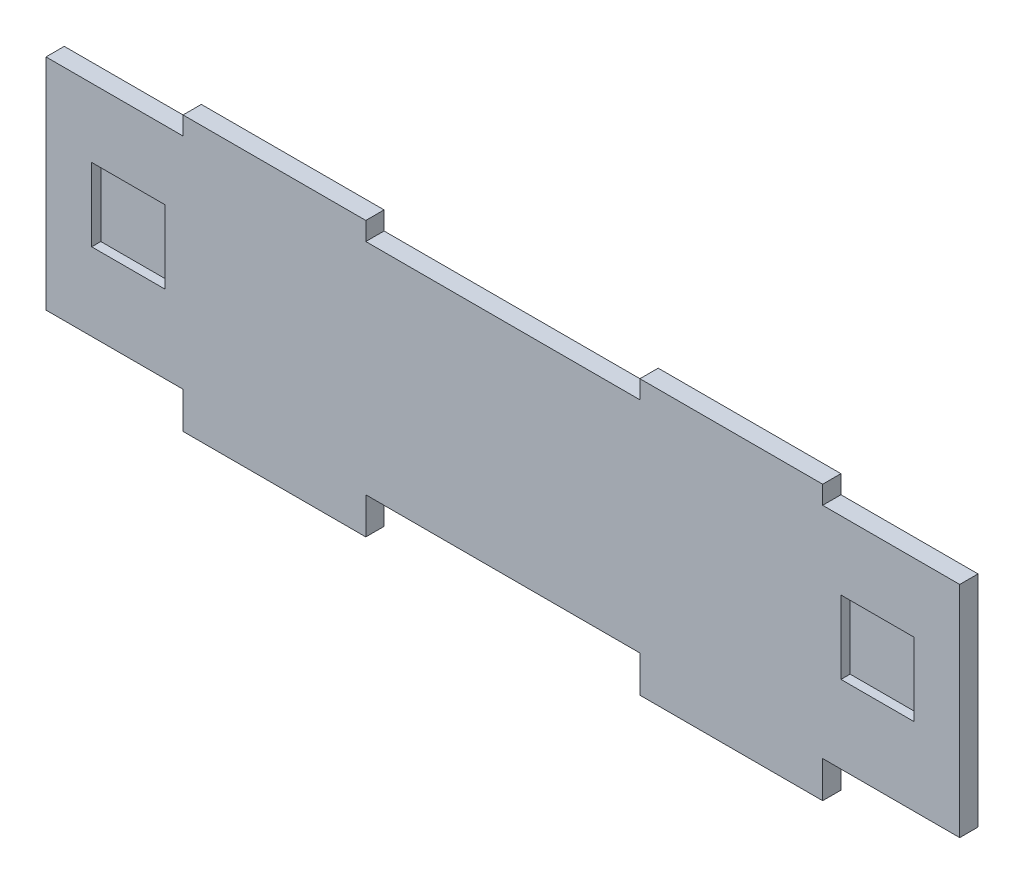
ISO-10303-21;
HEADER;
FILE_DESCRIPTION(('STEP AP214'),'2;1');
FILE_NAME('part.step','',(''),(''),'','','');
FILE_SCHEMA(('AUTOMOTIVE_DESIGN { 1 0 10303 214 1 1 1 1 }'));
ENDSEC;
DATA;
#1=APPLICATION_CONTEXT('core data for automotive mechanical design processes');
#2=APPLICATION_PROTOCOL_DEFINITION('international standard','automotive_design',2000,#1);
#3=PRODUCT_CONTEXT('',#1,'mechanical');
#4=PRODUCT('Part','Part','',(#3));
#5=PRODUCT_RELATED_PRODUCT_CATEGORY('part','',(#4));
#6=PRODUCT_DEFINITION_FORMATION('','',#4);
#7=PRODUCT_DEFINITION_CONTEXT('part definition',#1,'design');
#8=PRODUCT_DEFINITION('design','',#6,#7);
#9=PRODUCT_DEFINITION_SHAPE('','',#8);
#10=(LENGTH_UNIT() NAMED_UNIT(*) SI_UNIT(.MILLI.,.METRE.));
#11=(NAMED_UNIT(*) PLANE_ANGLE_UNIT() SI_UNIT($,.RADIAN.));
#12=(NAMED_UNIT(*) SI_UNIT($,.STERADIAN.) SOLID_ANGLE_UNIT());
#13=UNCERTAINTY_MEASURE_WITH_UNIT(LENGTH_MEASURE(1.E-05),#10,'distance_accuracy_value','');
#14=(GEOMETRIC_REPRESENTATION_CONTEXT(3) GLOBAL_UNCERTAINTY_ASSIGNED_CONTEXT((#13)) GLOBAL_UNIT_ASSIGNED_CONTEXT((#10,
#11,#12)) REPRESENTATION_CONTEXT('',''));
#15=CARTESIAN_POINT('',(0.,0.,0.));
#16=DIRECTION('',(0.,0.,1.));
#17=DIRECTION('',(1.,0.,0.));
#18=AXIS2_PLACEMENT_3D('',#15,#16,#17);
#19=CARTESIAN_POINT('',(30.,60.,4.));
#20=DIRECTION('',(1.,0.,0.));
#21=DIRECTION('',(0.,0.,-1.));
#22=AXIS2_PLACEMENT_3D('',#19,#20,#21);
#23=PLANE('',#22);
#24=DIRECTION('',(0.,-1.,0.));
#25=VECTOR('',#24,1.);
#26=CARTESIAN_POINT('',(30.,60.,0.));
#27=LINE('',#26,#25);
#28=CARTESIAN_POINT('',(30.,60.,0.));
#29=VERTEX_POINT('',#28);
#30=CARTESIAN_POINT('',(30.,56.,0.));
#31=VERTEX_POINT('',#30);
#32=EDGE_CURVE('E280',#29,#31,#27,.T.);
#33=ORIENTED_EDGE('',*,*,#32,.T.);
#34=DIRECTION('',(0.,0.,-1.));
#35=VECTOR('',#34,1.);
#36=CARTESIAN_POINT('',(30.,56.,4.));
#37=LINE('',#36,#35);
#38=CARTESIAN_POINT('',(30.,56.,4.));
#39=VERTEX_POINT('',#38);
#40=EDGE_CURVE('E11',#39,#31,#37,.T.);
#41=ORIENTED_EDGE('',*,*,#40,.F.);
#42=DIRECTION('',(0.,-1.,0.));
#43=VECTOR('',#42,1.);
#44=CARTESIAN_POINT('',(30.,60.,4.));
#45=LINE('',#44,#43);
#46=CARTESIAN_POINT('',(30.,60.,4.));
#47=VERTEX_POINT('',#46);
#48=EDGE_CURVE('E286',#47,#39,#45,.T.);
#49=ORIENTED_EDGE('',*,*,#48,.F.);
#50=DIRECTION('',(0.,0.,-1.));
#51=VECTOR('',#50,1.);
#52=CARTESIAN_POINT('',(30.,60.,4.));
#53=LINE('',#52,#51);
#54=EDGE_CURVE('E328',#47,#29,#53,.T.);
#55=ORIENTED_EDGE('',*,*,#54,.T.);
#56=EDGE_LOOP('',(#33,#41,#49,#55));
#57=FACE_BOUND('',#56,.T.);
#58=ADVANCED_FACE('F33',(#57),#23,.F.);
#59=CARTESIAN_POINT('',(0.,56.,4.));
#60=DIRECTION('',(0.,-1.,0.));
#61=DIRECTION('',(0.,0.,-1.));
#62=AXIS2_PLACEMENT_3D('',#59,#60,#61);
#63=PLANE('',#62);
#64=DIRECTION('',(-1.,0.,0.));
#65=VECTOR('',#64,1.);
#66=CARTESIAN_POINT('',(0.,56.,0.));
#67=LINE('',#66,#65);
#68=CARTESIAN_POINT('',(0.,56.,0.));
#69=VERTEX_POINT('',#68);
#70=EDGE_CURVE('E331',#31,#69,#67,.T.);
#71=ORIENTED_EDGE('',*,*,#70,.T.);
#72=DIRECTION('',(0.,0.,-1.));
#73=VECTOR('',#72,1.);
#74=CARTESIAN_POINT('',(0.,56.,4.));
#75=LINE('',#74,#73);
#76=CARTESIAN_POINT('',(0.,56.,4.));
#77=VERTEX_POINT('',#76);
#78=EDGE_CURVE('E40',#77,#69,#75,.T.);
#79=ORIENTED_EDGE('',*,*,#78,.F.);
#80=DIRECTION('',(-1.,0.,0.));
#81=VECTOR('',#80,1.);
#82=CARTESIAN_POINT('',(0.,56.,4.));
#83=LINE('',#82,#81);
#84=EDGE_CURVE('E289',#39,#77,#83,.T.);
#85=ORIENTED_EDGE('',*,*,#84,.F.);
#86=ORIENTED_EDGE('',*,*,#40,.T.);
#87=EDGE_LOOP('',(#71,#79,#85,#86));
#88=FACE_BOUND('',#87,.T.);
#89=ADVANCED_FACE('F448',(#88),#63,.F.);
#90=CARTESIAN_POINT('',(0.,8.,4.));
#91=DIRECTION('',(1.,0.,0.));
#92=DIRECTION('',(0.,1.,0.));
#93=AXIS2_PLACEMENT_3D('',#90,#91,#92);
#94=PLANE('',#93);
#95=DIRECTION('',(0.,-1.,0.));
#96=VECTOR('',#95,1.);
#97=CARTESIAN_POINT('',(0.,8.,0.));
#98=LINE('',#97,#96);
#99=CARTESIAN_POINT('',(0.,8.,0.));
#100=VERTEX_POINT('',#99);
#101=EDGE_CURVE('E333',#69,#100,#98,.T.);
#102=ORIENTED_EDGE('',*,*,#101,.T.);
#103=DIRECTION('',(0.,0.,-1.));
#104=VECTOR('',#103,1.);
#105=CARTESIAN_POINT('',(0.,8.,4.));
#106=LINE('',#105,#104);
#107=CARTESIAN_POINT('',(0.,8.,4.));
#108=VERTEX_POINT('',#107);
#109=EDGE_CURVE('E418',#108,#100,#106,.T.);
#110=ORIENTED_EDGE('',*,*,#109,.F.);
#111=DIRECTION('',(0.,-1.,0.));
#112=VECTOR('',#111,1.);
#113=CARTESIAN_POINT('',(0.,8.,4.));
#114=LINE('',#113,#112);
#115=EDGE_CURVE('E292',#77,#108,#114,.T.);
#116=ORIENTED_EDGE('',*,*,#115,.F.);
#117=ORIENTED_EDGE('',*,*,#78,.T.);
#118=EDGE_LOOP('',(#102,#110,#116,#117));
#119=FACE_BOUND('',#118,.T.);
#120=ADVANCED_FACE('F425',(#119),#94,.F.);
#121=CARTESIAN_POINT('',(0.,8.,4.));
#122=DIRECTION('',(0.,1.,0.));
#123=DIRECTION('',(-1.,0.,0.));
#124=AXIS2_PLACEMENT_3D('',#121,#122,#123);
#125=PLANE('',#124);
#126=DIRECTION('',(1.,0.,0.));
#127=VECTOR('',#126,1.);
#128=CARTESIAN_POINT('',(0.,8.,0.));
#129=LINE('',#128,#127);
#130=CARTESIAN_POINT('',(30.,8.,0.));
#131=VERTEX_POINT('',#130);
#132=EDGE_CURVE('E335',#100,#131,#129,.T.);
#133=ORIENTED_EDGE('',*,*,#132,.T.);
#134=DIRECTION('',(0.,0.,-1.));
#135=VECTOR('',#134,1.);
#136=CARTESIAN_POINT('',(30.,8.,4.));
#137=LINE('',#136,#135);
#138=CARTESIAN_POINT('',(30.,8.,4.));
#139=VERTEX_POINT('',#138);
#140=EDGE_CURVE('E415',#139,#131,#137,.T.);
#141=ORIENTED_EDGE('',*,*,#140,.F.);
#142=DIRECTION('',(1.,0.,0.));
#143=VECTOR('',#142,1.);
#144=CARTESIAN_POINT('',(0.,8.,4.));
#145=LINE('',#144,#143);
#146=EDGE_CURVE('E294',#108,#139,#145,.T.);
#147=ORIENTED_EDGE('',*,*,#146,.F.);
#148=ORIENTED_EDGE('',*,*,#109,.T.);
#149=EDGE_LOOP('',(#133,#141,#147,#148));
#150=FACE_BOUND('',#149,.T.);
#151=ADVANCED_FACE('F436',(#150),#125,.F.);
#152=CARTESIAN_POINT('',(30.,0.,4.));
#153=DIRECTION('',(1.,0.,0.));
#154=DIRECTION('',(0.,0.,-1.));
#155=AXIS2_PLACEMENT_3D('',#152,#153,#154);
#156=PLANE('',#155);
#157=DIRECTION('',(0.,-1.,0.));
#158=VECTOR('',#157,1.);
#159=CARTESIAN_POINT('',(30.,0.,0.));
#160=LINE('',#159,#158);
#161=CARTESIAN_POINT('',(30.,0.,0.));
#162=VERTEX_POINT('',#161);
#163=EDGE_CURVE('E337',#131,#162,#160,.T.);
#164=ORIENTED_EDGE('',*,*,#163,.T.);
#165=DIRECTION('',(0.,0.,-1.));
#166=VECTOR('',#165,1.);
#167=CARTESIAN_POINT('',(30.,0.,4.));
#168=LINE('',#167,#166);
#169=CARTESIAN_POINT('',(30.,0.,4.));
#170=VERTEX_POINT('',#169);
#171=EDGE_CURVE('E412',#170,#162,#168,.T.);
#172=ORIENTED_EDGE('',*,*,#171,.F.);
#173=DIRECTION('',(0.,-1.,0.));
#174=VECTOR('',#173,1.);
#175=CARTESIAN_POINT('',(30.,0.,4.));
#176=LINE('',#175,#174);
#177=EDGE_CURVE('E296',#139,#170,#176,.T.);
#178=ORIENTED_EDGE('',*,*,#177,.F.);
#179=ORIENTED_EDGE('',*,*,#140,.T.);
#180=EDGE_LOOP('',(#164,#172,#178,#179));
#181=FACE_BOUND('',#180,.T.);
#182=ADVANCED_FACE('F440',(#181),#156,.F.);
#183=CARTESIAN_POINT('',(30.,0.,4.));
#184=DIRECTION('',(0.,1.,0.));
#185=DIRECTION('',(0.,0.,1.));
#186=AXIS2_PLACEMENT_3D('',#183,#184,#185);
#187=PLANE('',#186);
#188=DIRECTION('',(1.,0.,0.));
#189=VECTOR('',#188,1.);
#190=CARTESIAN_POINT('',(30.,0.,0.));
#191=LINE('',#190,#189);
#192=CARTESIAN_POINT('',(70.,0.,0.));
#193=VERTEX_POINT('',#192);
#194=EDGE_CURVE('E339',#162,#193,#191,.T.);
#195=ORIENTED_EDGE('',*,*,#194,.T.);
#196=DIRECTION('',(0.,0.,-1.));
#197=VECTOR('',#196,1.);
#198=CARTESIAN_POINT('',(70.,0.,4.));
#199=LINE('',#198,#197);
#200=CARTESIAN_POINT('',(70.,0.,4.));
#201=VERTEX_POINT('',#200);
#202=EDGE_CURVE('E409',#201,#193,#199,.T.);
#203=ORIENTED_EDGE('',*,*,#202,.F.);
#204=DIRECTION('',(1.,0.,0.));
#205=VECTOR('',#204,1.);
#206=CARTESIAN_POINT('',(30.,0.,4.));
#207=LINE('',#206,#205);
#208=EDGE_CURVE('E298',#170,#201,#207,.T.);
#209=ORIENTED_EDGE('',*,*,#208,.F.);
#210=ORIENTED_EDGE('',*,*,#171,.T.);
#211=EDGE_LOOP('',(#195,#203,#209,#210));
#212=FACE_BOUND('',#211,.T.);
#213=ADVANCED_FACE('F521',(#212),#187,.F.);
#214=CARTESIAN_POINT('',(70.,0.,4.));
#215=DIRECTION('',(-1.,0.,0.));
#216=DIRECTION('',(0.,0.,1.));
#217=AXIS2_PLACEMENT_3D('',#214,#215,#216);
#218=PLANE('',#217);
#219=DIRECTION('',(0.,1.,0.));
#220=VECTOR('',#219,1.);
#221=CARTESIAN_POINT('',(70.,0.,0.));
#222=LINE('',#221,#220);
#223=CARTESIAN_POINT('',(70.,8.,0.));
#224=VERTEX_POINT('',#223);
#225=EDGE_CURVE('E341',#193,#224,#222,.T.);
#226=ORIENTED_EDGE('',*,*,#225,.T.);
#227=DIRECTION('',(0.,0.,-1.));
#228=VECTOR('',#227,1.);
#229=CARTESIAN_POINT('',(70.,8.,4.));
#230=LINE('',#229,#228);
#231=CARTESIAN_POINT('',(70.,8.,4.));
#232=VERTEX_POINT('',#231);
#233=EDGE_CURVE('E406',#232,#224,#230,.T.);
#234=ORIENTED_EDGE('',*,*,#233,.F.);
#235=DIRECTION('',(0.,1.,0.));
#236=VECTOR('',#235,1.);
#237=CARTESIAN_POINT('',(70.,0.,4.));
#238=LINE('',#237,#236);
#239=EDGE_CURVE('E300',#201,#232,#238,.T.);
#240=ORIENTED_EDGE('',*,*,#239,.F.);
#241=ORIENTED_EDGE('',*,*,#202,.T.);
#242=EDGE_LOOP('',(#226,#234,#240,#241));
#243=FACE_BOUND('',#242,.T.);
#244=ADVANCED_FACE('F519',(#243),#218,.F.);
#245=CARTESIAN_POINT('',(70.,8.,4.));
#246=DIRECTION('',(0.,1.,0.));
#247=DIRECTION('',(0.,0.,1.));
#248=AXIS2_PLACEMENT_3D('',#245,#246,#247);
#249=PLANE('',#248);
#250=DIRECTION('',(1.,0.,0.));
#251=VECTOR('',#250,1.);
#252=CARTESIAN_POINT('',(70.,8.,0.));
#253=LINE('',#252,#251);
#254=CARTESIAN_POINT('',(130.,8.,0.));
#255=VERTEX_POINT('',#254);
#256=EDGE_CURVE('E343',#224,#255,#253,.T.);
#257=ORIENTED_EDGE('',*,*,#256,.T.);
#258=DIRECTION('',(0.,0.,-1.));
#259=VECTOR('',#258,1.);
#260=CARTESIAN_POINT('',(130.,8.,4.));
#261=LINE('',#260,#259);
#262=CARTESIAN_POINT('',(130.,8.,4.));
#263=VERTEX_POINT('',#262);
#264=EDGE_CURVE('E403',#263,#255,#261,.T.);
#265=ORIENTED_EDGE('',*,*,#264,.F.);
#266=DIRECTION('',(1.,0.,0.));
#267=VECTOR('',#266,1.);
#268=CARTESIAN_POINT('',(70.,8.,4.));
#269=LINE('',#268,#267);
#270=EDGE_CURVE('E302',#232,#263,#269,.T.);
#271=ORIENTED_EDGE('',*,*,#270,.F.);
#272=ORIENTED_EDGE('',*,*,#233,.T.);
#273=EDGE_LOOP('',(#257,#265,#271,#272));
#274=FACE_BOUND('',#273,.T.);
#275=ADVANCED_FACE('F514',(#274),#249,.F.);
#276=CARTESIAN_POINT('',(130.,0.,4.));
#277=DIRECTION('',(1.,0.,0.));
#278=DIRECTION('',(0.,0.,-1.));
#279=AXIS2_PLACEMENT_3D('',#276,#277,#278);
#280=PLANE('',#279);
#281=DIRECTION('',(0.,-1.,0.));
#282=VECTOR('',#281,1.);
#283=CARTESIAN_POINT('',(130.,0.,0.));
#284=LINE('',#283,#282);
#285=CARTESIAN_POINT('',(130.,0.,0.));
#286=VERTEX_POINT('',#285);
#287=EDGE_CURVE('E345',#255,#286,#284,.T.);
#288=ORIENTED_EDGE('',*,*,#287,.T.);
#289=DIRECTION('',(0.,0.,-1.));
#290=VECTOR('',#289,1.);
#291=CARTESIAN_POINT('',(130.,0.,4.));
#292=LINE('',#291,#290);
#293=CARTESIAN_POINT('',(130.,0.,4.));
#294=VERTEX_POINT('',#293);
#295=EDGE_CURVE('E400',#294,#286,#292,.T.);
#296=ORIENTED_EDGE('',*,*,#295,.F.);
#297=DIRECTION('',(0.,-1.,0.));
#298=VECTOR('',#297,1.);
#299=CARTESIAN_POINT('',(130.,0.,4.));
#300=LINE('',#299,#298);
#301=EDGE_CURVE('E304',#263,#294,#300,.T.);
#302=ORIENTED_EDGE('',*,*,#301,.F.);
#303=ORIENTED_EDGE('',*,*,#264,.T.);
#304=EDGE_LOOP('',(#288,#296,#302,#303));
#305=FACE_BOUND('',#304,.T.);
#306=ADVANCED_FACE('F509',(#305),#280,.F.);
#307=CARTESIAN_POINT('',(130.,0.,4.));
#308=DIRECTION('',(0.,1.,0.));
#309=DIRECTION('',(0.,0.,1.));
#310=AXIS2_PLACEMENT_3D('',#307,#308,#309);
#311=PLANE('',#310);
#312=DIRECTION('',(1.,0.,0.));
#313=VECTOR('',#312,1.);
#314=CARTESIAN_POINT('',(130.,0.,0.));
#315=LINE('',#314,#313);
#316=CARTESIAN_POINT('',(170.,0.,0.));
#317=VERTEX_POINT('',#316);
#318=EDGE_CURVE('E347',#286,#317,#315,.T.);
#319=ORIENTED_EDGE('',*,*,#318,.T.);
#320=DIRECTION('',(0.,0.,-1.));
#321=VECTOR('',#320,1.);
#322=CARTESIAN_POINT('',(170.,0.,4.));
#323=LINE('',#322,#321);
#324=CARTESIAN_POINT('',(170.,0.,4.));
#325=VERTEX_POINT('',#324);
#326=EDGE_CURVE('E397',#325,#317,#323,.T.);
#327=ORIENTED_EDGE('',*,*,#326,.F.);
#328=DIRECTION('',(1.,0.,0.));
#329=VECTOR('',#328,1.);
#330=CARTESIAN_POINT('',(130.,0.,4.));
#331=LINE('',#330,#329);
#332=EDGE_CURVE('E306',#294,#325,#331,.T.);
#333=ORIENTED_EDGE('',*,*,#332,.F.);
#334=ORIENTED_EDGE('',*,*,#295,.T.);
#335=EDGE_LOOP('',(#319,#327,#333,#334));
#336=FACE_BOUND('',#335,.T.);
#337=ADVANCED_FACE('F505',(#336),#311,.F.);
#338=CARTESIAN_POINT('',(170.,0.,4.));
#339=DIRECTION('',(-1.,0.,0.));
#340=DIRECTION('',(0.,0.,1.));
#341=AXIS2_PLACEMENT_3D('',#338,#339,#340);
#342=PLANE('',#341);
#343=DIRECTION('',(0.,1.,0.));
#344=VECTOR('',#343,1.);
#345=CARTESIAN_POINT('',(170.,0.,0.));
#346=LINE('',#345,#344);
#347=CARTESIAN_POINT('',(170.,7.99999999999999,0.));
#348=VERTEX_POINT('',#347);
#349=EDGE_CURVE('E349',#317,#348,#346,.T.);
#350=ORIENTED_EDGE('',*,*,#349,.T.);
#351=DIRECTION('',(0.,0.,-1.));
#352=VECTOR('',#351,1.);
#353=CARTESIAN_POINT('',(170.,7.99999999999999,4.));
#354=LINE('',#353,#352);
#355=CARTESIAN_POINT('',(170.,7.99999999999999,4.));
#356=VERTEX_POINT('',#355);
#357=EDGE_CURVE('E394',#356,#348,#354,.T.);
#358=ORIENTED_EDGE('',*,*,#357,.F.);
#359=DIRECTION('',(0.,1.,0.));
#360=VECTOR('',#359,1.);
#361=CARTESIAN_POINT('',(170.,0.,4.));
#362=LINE('',#361,#360);
#363=EDGE_CURVE('E308',#325,#356,#362,.T.);
#364=ORIENTED_EDGE('',*,*,#363,.F.);
#365=ORIENTED_EDGE('',*,*,#326,.T.);
#366=EDGE_LOOP('',(#350,#358,#364,#365));
#367=FACE_BOUND('',#366,.T.);
#368=ADVANCED_FACE('F500',(#367),#342,.F.);
#369=CARTESIAN_POINT('',(170.,7.99999999999999,4.));
#370=DIRECTION('',(0.,1.,0.));
#371=DIRECTION('',(-1.,0.,0.));
#372=AXIS2_PLACEMENT_3D('',#369,#370,#371);
#373=PLANE('',#372);
#374=DIRECTION('',(1.,0.,0.));
#375=VECTOR('',#374,1.);
#376=CARTESIAN_POINT('',(170.,7.99999999999999,0.));
#377=LINE('',#376,#375);
#378=CARTESIAN_POINT('',(200.,8.,0.));
#379=VERTEX_POINT('',#378);
#380=EDGE_CURVE('E351',#348,#379,#377,.T.);
#381=ORIENTED_EDGE('',*,*,#380,.T.);
#382=DIRECTION('',(0.,0.,-1.));
#383=VECTOR('',#382,1.);
#384=CARTESIAN_POINT('',(200.,8.,4.));
#385=LINE('',#384,#383);
#386=CARTESIAN_POINT('',(200.,8.,4.));
#387=VERTEX_POINT('',#386);
#388=EDGE_CURVE('E391',#387,#379,#385,.T.);
#389=ORIENTED_EDGE('',*,*,#388,.F.);
#390=DIRECTION('',(1.,0.,0.));
#391=VECTOR('',#390,1.);
#392=CARTESIAN_POINT('',(170.,7.99999999999999,4.));
#393=LINE('',#392,#391);
#394=EDGE_CURVE('E310',#356,#387,#393,.T.);
#395=ORIENTED_EDGE('',*,*,#394,.F.);
#396=ORIENTED_EDGE('',*,*,#357,.T.);
#397=EDGE_LOOP('',(#381,#389,#395,#396));
#398=FACE_BOUND('',#397,.T.);
#399=ADVANCED_FACE('F494',(#398),#373,.F.);
#400=CARTESIAN_POINT('',(200.,8.,4.));
#401=DIRECTION('',(-1.,0.,0.));
#402=DIRECTION('',(0.,0.,1.));
#403=AXIS2_PLACEMENT_3D('',#400,#401,#402);
#404=PLANE('',#403);
#405=DIRECTION('',(0.,1.,0.));
#406=VECTOR('',#405,1.);
#407=CARTESIAN_POINT('',(200.,8.,0.));
#408=LINE('',#407,#406);
#409=CARTESIAN_POINT('',(200.,56.,0.));
#410=VERTEX_POINT('',#409);
#411=EDGE_CURVE('E353',#379,#410,#408,.T.);
#412=ORIENTED_EDGE('',*,*,#411,.T.);
#413=DIRECTION('',(0.,0.,-1.));
#414=VECTOR('',#413,1.);
#415=CARTESIAN_POINT('',(200.,56.,4.));
#416=LINE('',#415,#414);
#417=CARTESIAN_POINT('',(200.,56.,4.));
#418=VERTEX_POINT('',#417);
#419=EDGE_CURVE('E388',#418,#410,#416,.T.);
#420=ORIENTED_EDGE('',*,*,#419,.F.);
#421=DIRECTION('',(0.,1.,0.));
#422=VECTOR('',#421,1.);
#423=CARTESIAN_POINT('',(200.,8.,4.));
#424=LINE('',#423,#422);
#425=EDGE_CURVE('E312',#387,#418,#424,.T.);
#426=ORIENTED_EDGE('',*,*,#425,.F.);
#427=ORIENTED_EDGE('',*,*,#388,.T.);
#428=EDGE_LOOP('',(#412,#420,#426,#427));
#429=FACE_BOUND('',#428,.T.);
#430=ADVANCED_FACE('F490',(#429),#404,.F.);
#431=CARTESIAN_POINT('',(170.,56.,4.));
#432=DIRECTION('',(0.,-1.,0.));
#433=DIRECTION('',(0.,0.,-1.));
#434=AXIS2_PLACEMENT_3D('',#431,#432,#433);
#435=PLANE('',#434);
#436=DIRECTION('',(-1.,0.,0.));
#437=VECTOR('',#436,1.);
#438=CARTESIAN_POINT('',(170.,56.,0.));
#439=LINE('',#438,#437);
#440=CARTESIAN_POINT('',(170.,56.,0.));
#441=VERTEX_POINT('',#440);
#442=EDGE_CURVE('E355',#410,#441,#439,.T.);
#443=ORIENTED_EDGE('',*,*,#442,.T.);
#444=DIRECTION('',(0.,0.,-1.));
#445=VECTOR('',#444,1.);
#446=CARTESIAN_POINT('',(170.,56.,4.));
#447=LINE('',#446,#445);
#448=CARTESIAN_POINT('',(170.,56.,4.));
#449=VERTEX_POINT('',#448);
#450=EDGE_CURVE('E385',#449,#441,#447,.T.);
#451=ORIENTED_EDGE('',*,*,#450,.F.);
#452=DIRECTION('',(-1.,0.,0.));
#453=VECTOR('',#452,1.);
#454=CARTESIAN_POINT('',(170.,56.,4.));
#455=LINE('',#454,#453);
#456=EDGE_CURVE('E314',#418,#449,#455,.T.);
#457=ORIENTED_EDGE('',*,*,#456,.F.);
#458=ORIENTED_EDGE('',*,*,#419,.T.);
#459=EDGE_LOOP('',(#443,#451,#457,#458));
#460=FACE_BOUND('',#459,.T.);
#461=ADVANCED_FACE('F485',(#460),#435,.F.);
#462=CARTESIAN_POINT('',(170.,60.,4.));
#463=DIRECTION('',(-1.,0.,0.));
#464=DIRECTION('',(0.,0.,1.));
#465=AXIS2_PLACEMENT_3D('',#462,#463,#464);
#466=PLANE('',#465);
#467=DIRECTION('',(0.,1.,0.));
#468=VECTOR('',#467,1.);
#469=CARTESIAN_POINT('',(170.,60.,0.));
#470=LINE('',#469,#468);
#471=CARTESIAN_POINT('',(170.,60.,0.));
#472=VERTEX_POINT('',#471);
#473=EDGE_CURVE('E357',#441,#472,#470,.T.);
#474=ORIENTED_EDGE('',*,*,#473,.T.);
#475=DIRECTION('',(0.,0.,-1.));
#476=VECTOR('',#475,1.);
#477=CARTESIAN_POINT('',(170.,60.,4.));
#478=LINE('',#477,#476);
#479=CARTESIAN_POINT('',(170.,60.,4.));
#480=VERTEX_POINT('',#479);
#481=EDGE_CURVE('E382',#480,#472,#478,.T.);
#482=ORIENTED_EDGE('',*,*,#481,.F.);
#483=DIRECTION('',(0.,1.,0.));
#484=VECTOR('',#483,1.);
#485=CARTESIAN_POINT('',(170.,60.,4.));
#486=LINE('',#485,#484);
#487=EDGE_CURVE('E316',#449,#480,#486,.T.);
#488=ORIENTED_EDGE('',*,*,#487,.F.);
#489=ORIENTED_EDGE('',*,*,#450,.T.);
#490=EDGE_LOOP('',(#474,#482,#488,#489));
#491=FACE_BOUND('',#490,.T.);
#492=ADVANCED_FACE('F479',(#491),#466,.F.);
#493=CARTESIAN_POINT('',(130.,60.,4.));
#494=DIRECTION('',(0.,-1.,0.));
#495=DIRECTION('',(0.,0.,-1.));
#496=AXIS2_PLACEMENT_3D('',#493,#494,#495);
#497=PLANE('',#496);
#498=DIRECTION('',(-1.,0.,0.));
#499=VECTOR('',#498,1.);
#500=CARTESIAN_POINT('',(130.,60.,0.));
#501=LINE('',#500,#499);
#502=CARTESIAN_POINT('',(130.,60.,0.));
#503=VERTEX_POINT('',#502);
#504=EDGE_CURVE('E359',#472,#503,#501,.T.);
#505=ORIENTED_EDGE('',*,*,#504,.T.);
#506=DIRECTION('',(0.,0.,-1.));
#507=VECTOR('',#506,1.);
#508=CARTESIAN_POINT('',(130.,60.,4.));
#509=LINE('',#508,#507);
#510=CARTESIAN_POINT('',(130.,60.,4.));
#511=VERTEX_POINT('',#510);
#512=EDGE_CURVE('E379',#511,#503,#509,.T.);
#513=ORIENTED_EDGE('',*,*,#512,.F.);
#514=DIRECTION('',(-1.,0.,0.));
#515=VECTOR('',#514,1.);
#516=CARTESIAN_POINT('',(130.,60.,4.));
#517=LINE('',#516,#515);
#518=EDGE_CURVE('E318',#480,#511,#517,.T.);
#519=ORIENTED_EDGE('',*,*,#518,.F.);
#520=ORIENTED_EDGE('',*,*,#481,.T.);
#521=EDGE_LOOP('',(#505,#513,#519,#520));
#522=FACE_BOUND('',#521,.T.);
#523=ADVANCED_FACE('F475',(#522),#497,.F.);
#524=CARTESIAN_POINT('',(130.,60.,4.));
#525=DIRECTION('',(1.,0.,0.));
#526=DIRECTION('',(0.,0.,-1.));
#527=AXIS2_PLACEMENT_3D('',#524,#525,#526);
#528=PLANE('',#527);
#529=DIRECTION('',(0.,-1.,0.));
#530=VECTOR('',#529,1.);
#531=CARTESIAN_POINT('',(130.,60.,0.));
#532=LINE('',#531,#530);
#533=CARTESIAN_POINT('',(130.,56.,0.));
#534=VERTEX_POINT('',#533);
#535=EDGE_CURVE('E361',#503,#534,#532,.T.);
#536=ORIENTED_EDGE('',*,*,#535,.T.);
#537=DIRECTION('',(0.,0.,-1.));
#538=VECTOR('',#537,1.);
#539=CARTESIAN_POINT('',(130.,56.,4.));
#540=LINE('',#539,#538);
#541=CARTESIAN_POINT('',(130.,56.,4.));
#542=VERTEX_POINT('',#541);
#543=EDGE_CURVE('E376',#542,#534,#540,.T.);
#544=ORIENTED_EDGE('',*,*,#543,.F.);
#545=DIRECTION('',(0.,-1.,0.));
#546=VECTOR('',#545,1.);
#547=CARTESIAN_POINT('',(130.,60.,4.));
#548=LINE('',#547,#546);
#549=EDGE_CURVE('E320',#511,#542,#548,.T.);
#550=ORIENTED_EDGE('',*,*,#549,.F.);
#551=ORIENTED_EDGE('',*,*,#512,.T.);
#552=EDGE_LOOP('',(#536,#544,#550,#551));
#553=FACE_BOUND('',#552,.T.);
#554=ADVANCED_FACE('F470',(#553),#528,.F.);
#555=CARTESIAN_POINT('',(70.,56.,4.));
#556=DIRECTION('',(0.,-1.,0.));
#557=DIRECTION('',(0.,0.,-1.));
#558=AXIS2_PLACEMENT_3D('',#555,#556,#557);
#559=PLANE('',#558);
#560=DIRECTION('',(-1.,0.,0.));
#561=VECTOR('',#560,1.);
#562=CARTESIAN_POINT('',(70.,56.,0.));
#563=LINE('',#562,#561);
#564=CARTESIAN_POINT('',(70.,56.,0.));
#565=VERTEX_POINT('',#564);
#566=EDGE_CURVE('E363',#534,#565,#563,.T.);
#567=ORIENTED_EDGE('',*,*,#566,.T.);
#568=DIRECTION('',(0.,0.,-1.));
#569=VECTOR('',#568,1.);
#570=CARTESIAN_POINT('',(70.,56.,4.));
#571=LINE('',#570,#569);
#572=CARTESIAN_POINT('',(70.,56.,4.));
#573=VERTEX_POINT('',#572);
#574=EDGE_CURVE('E373',#573,#565,#571,.T.);
#575=ORIENTED_EDGE('',*,*,#574,.F.);
#576=DIRECTION('',(-1.,0.,0.));
#577=VECTOR('',#576,1.);
#578=CARTESIAN_POINT('',(70.,56.,4.));
#579=LINE('',#578,#577);
#580=EDGE_CURVE('E322',#542,#573,#579,.T.);
#581=ORIENTED_EDGE('',*,*,#580,.F.);
#582=ORIENTED_EDGE('',*,*,#543,.T.);
#583=EDGE_LOOP('',(#567,#575,#581,#582));
#584=FACE_BOUND('',#583,.T.);
#585=ADVANCED_FACE('F464',(#584),#559,.F.);
#586=CARTESIAN_POINT('',(70.,60.,4.));
#587=DIRECTION('',(-1.,0.,0.));
#588=DIRECTION('',(0.,0.,1.));
#589=AXIS2_PLACEMENT_3D('',#586,#587,#588);
#590=PLANE('',#589);
#591=DIRECTION('',(0.,1.,0.));
#592=VECTOR('',#591,1.);
#593=CARTESIAN_POINT('',(70.,60.,0.));
#594=LINE('',#593,#592);
#595=CARTESIAN_POINT('',(70.,60.,0.));
#596=VERTEX_POINT('',#595);
#597=EDGE_CURVE('E365',#565,#596,#594,.T.);
#598=ORIENTED_EDGE('',*,*,#597,.T.);
#599=DIRECTION('',(0.,0.,-1.));
#600=VECTOR('',#599,1.);
#601=CARTESIAN_POINT('',(70.,60.,4.));
#602=LINE('',#601,#600);
#603=CARTESIAN_POINT('',(70.,60.,4.));
#604=VERTEX_POINT('',#603);
#605=EDGE_CURVE('E370',#604,#596,#602,.T.);
#606=ORIENTED_EDGE('',*,*,#605,.F.);
#607=DIRECTION('',(0.,1.,0.));
#608=VECTOR('',#607,1.);
#609=CARTESIAN_POINT('',(70.,60.,4.));
#610=LINE('',#609,#608);
#611=EDGE_CURVE('E324',#573,#604,#610,.T.);
#612=ORIENTED_EDGE('',*,*,#611,.F.);
#613=ORIENTED_EDGE('',*,*,#574,.T.);
#614=EDGE_LOOP('',(#598,#606,#612,#613));
#615=FACE_BOUND('',#614,.T.);
#616=ADVANCED_FACE('F460',(#615),#590,.F.);
#617=CARTESIAN_POINT('',(30.,60.,4.));
#618=DIRECTION('',(0.,-1.,0.));
#619=DIRECTION('',(0.,0.,-1.));
#620=AXIS2_PLACEMENT_3D('',#617,#618,#619);
#621=PLANE('',#620);
#622=DIRECTION('',(-1.,0.,0.));
#623=VECTOR('',#622,1.);
#624=CARTESIAN_POINT('',(30.,60.,0.));
#625=LINE('',#624,#623);
#626=EDGE_CURVE('E290',#596,#29,#625,.T.);
#627=ORIENTED_EDGE('',*,*,#626,.T.);
#628=ORIENTED_EDGE('',*,*,#54,.F.);
#629=DIRECTION('',(-1.,0.,0.));
#630=VECTOR('',#629,1.);
#631=CARTESIAN_POINT('',(30.,60.,4.));
#632=LINE('',#631,#630);
#633=EDGE_CURVE('E326',#604,#47,#632,.T.);
#634=ORIENTED_EDGE('',*,*,#633,.F.);
#635=ORIENTED_EDGE('',*,*,#605,.T.);
#636=EDGE_LOOP('',(#627,#628,#634,#635));
#637=FACE_BOUND('',#636,.T.);
#638=ADVANCED_FACE('F455',(#637),#621,.F.);
#639=CARTESIAN_POINT('',(0.,0.,4.));
#640=DIRECTION('',(0.,0.,1.));
#641=DIRECTION('',(1.,0.,0.));
#642=AXIS2_PLACEMENT_3D('',#639,#640,#641);
#643=PLANE('',#642);
#644=DIRECTION('',(0.,-1.,0.));
#645=VECTOR('',#644,1.);
#646=CARTESIAN_POINT('',(174.,41.,4.));
#647=LINE('',#646,#645);
#648=CARTESIAN_POINT('',(174.,41.,4.));
#649=VERTEX_POINT('',#648);
#650=CARTESIAN_POINT('',(174.,25.,4.));
#651=VERTEX_POINT('',#650);
#652=EDGE_CURVE('E47',#649,#651,#647,.T.);
#653=ORIENTED_EDGE('',*,*,#652,.F.);
#654=DIRECTION('',(-1.,0.,0.));
#655=VECTOR('',#654,1.);
#656=CARTESIAN_POINT('',(174.,41.,4.));
#657=LINE('',#656,#655);
#658=CARTESIAN_POINT('',(190.,41.,4.));
#659=VERTEX_POINT('',#658);
#660=EDGE_CURVE('E237',#659,#649,#657,.T.);
#661=ORIENTED_EDGE('',*,*,#660,.F.);
#662=DIRECTION('',(0.,1.,0.));
#663=VECTOR('',#662,1.);
#664=CARTESIAN_POINT('',(190.,41.,4.));
#665=LINE('',#664,#663);
#666=CARTESIAN_POINT('',(190.,25.,4.));
#667=VERTEX_POINT('',#666);
#668=EDGE_CURVE('E240',#667,#659,#665,.T.);
#669=ORIENTED_EDGE('',*,*,#668,.F.);
#670=DIRECTION('',(1.,0.,0.));
#671=VECTOR('',#670,1.);
#672=CARTESIAN_POINT('',(174.,25.,4.));
#673=LINE('',#672,#671);
#674=EDGE_CURVE('E246',#651,#667,#673,.T.);
#675=ORIENTED_EDGE('',*,*,#674,.F.);
#676=EDGE_LOOP('',(#653,#661,#669,#675));
#677=FACE_BOUND('',#676,.T.);
#678=DIRECTION('',(0.,-1.,0.));
#679=VECTOR('',#678,1.);
#680=CARTESIAN_POINT('',(10.,41.,4.));
#681=LINE('',#680,#679);
#682=CARTESIAN_POINT('',(10.,41.,4.));
#683=VERTEX_POINT('',#682);
#684=CARTESIAN_POINT('',(10.,25.,4.));
#685=VERTEX_POINT('',#684);
#686=EDGE_CURVE('E55',#683,#685,#681,.T.);
#687=ORIENTED_EDGE('',*,*,#686,.F.);
#688=DIRECTION('',(-1.,0.,0.));
#689=VECTOR('',#688,1.);
#690=CARTESIAN_POINT('',(10.,41.,4.));
#691=LINE('',#690,#689);
#692=CARTESIAN_POINT('',(26.,41.,4.));
#693=VERTEX_POINT('',#692);
#694=EDGE_CURVE('E259',#693,#683,#691,.T.);
#695=ORIENTED_EDGE('',*,*,#694,.F.);
#696=DIRECTION('',(0.,1.,0.));
#697=VECTOR('',#696,1.);
#698=CARTESIAN_POINT('',(26.,41.,4.));
#699=LINE('',#698,#697);
#700=CARTESIAN_POINT('',(26.,25.,4.));
#701=VERTEX_POINT('',#700);
#702=EDGE_CURVE('E273',#701,#693,#699,.T.);
#703=ORIENTED_EDGE('',*,*,#702,.F.);
#704=DIRECTION('',(1.,0.,0.));
#705=VECTOR('',#704,1.);
#706=CARTESIAN_POINT('',(10.,25.,4.));
#707=LINE('',#706,#705);
#708=EDGE_CURVE('E270',#685,#701,#707,.T.);
#709=ORIENTED_EDGE('',*,*,#708,.F.);
#710=EDGE_LOOP('',(#687,#695,#703,#709));
#711=FACE_BOUND('',#710,.T.);
#712=ORIENTED_EDGE('',*,*,#48,.T.);
#713=ORIENTED_EDGE('',*,*,#84,.T.);
#714=ORIENTED_EDGE('',*,*,#115,.T.);
#715=ORIENTED_EDGE('',*,*,#146,.T.);
#716=ORIENTED_EDGE('',*,*,#177,.T.);
#717=ORIENTED_EDGE('',*,*,#208,.T.);
#718=ORIENTED_EDGE('',*,*,#239,.T.);
#719=ORIENTED_EDGE('',*,*,#270,.T.);
#720=ORIENTED_EDGE('',*,*,#301,.T.);
#721=ORIENTED_EDGE('',*,*,#332,.T.);
#722=ORIENTED_EDGE('',*,*,#363,.T.);
#723=ORIENTED_EDGE('',*,*,#394,.T.);
#724=ORIENTED_EDGE('',*,*,#425,.T.);
#725=ORIENTED_EDGE('',*,*,#456,.T.);
#726=ORIENTED_EDGE('',*,*,#487,.T.);
#727=ORIENTED_EDGE('',*,*,#518,.T.);
#728=ORIENTED_EDGE('',*,*,#549,.T.);
#729=ORIENTED_EDGE('',*,*,#580,.T.);
#730=ORIENTED_EDGE('',*,*,#611,.T.);
#731=ORIENTED_EDGE('',*,*,#633,.T.);
#732=EDGE_LOOP('',(#712,#713,#714,#715,#716,#717,#718,#719,#720,#721,#722,#723,#724,#725,#726,
#727,#728,#729,#730,#731));
#733=FACE_BOUND('',#732,.T.);
#734=ADVANCED_FACE('F444',(#677,#711,#733),#643,.T.);
#735=CARTESIAN_POINT('',(0.,0.,0.));
#736=DIRECTION('',(0.,0.,1.));
#737=DIRECTION('',(1.,0.,0.));
#738=AXIS2_PLACEMENT_3D('',#735,#736,#737);
#739=PLANE('',#738);
#740=ORIENTED_EDGE('',*,*,#32,.F.);
#741=ORIENTED_EDGE('',*,*,#626,.F.);
#742=ORIENTED_EDGE('',*,*,#597,.F.);
#743=ORIENTED_EDGE('',*,*,#566,.F.);
#744=ORIENTED_EDGE('',*,*,#535,.F.);
#745=ORIENTED_EDGE('',*,*,#504,.F.);
#746=ORIENTED_EDGE('',*,*,#473,.F.);
#747=ORIENTED_EDGE('',*,*,#442,.F.);
#748=ORIENTED_EDGE('',*,*,#411,.F.);
#749=ORIENTED_EDGE('',*,*,#380,.F.);
#750=ORIENTED_EDGE('',*,*,#349,.F.);
#751=ORIENTED_EDGE('',*,*,#318,.F.);
#752=ORIENTED_EDGE('',*,*,#287,.F.);
#753=ORIENTED_EDGE('',*,*,#256,.F.);
#754=ORIENTED_EDGE('',*,*,#225,.F.);
#755=ORIENTED_EDGE('',*,*,#194,.F.);
#756=ORIENTED_EDGE('',*,*,#163,.F.);
#757=ORIENTED_EDGE('',*,*,#132,.F.);
#758=ORIENTED_EDGE('',*,*,#101,.F.);
#759=ORIENTED_EDGE('',*,*,#70,.F.);
#760=EDGE_LOOP('',(#740,#741,#742,#743,#744,#745,#746,#747,#748,#749,#750,#751,#752,#753,#754,
#755,#756,#757,#758,#759));
#761=FACE_BOUND('',#760,.T.);
#762=ADVANCED_FACE('F431',(#761),#739,.F.);
#763=CARTESIAN_POINT('',(10.,41.,2.));
#764=DIRECTION('',(-1.,0.,0.));
#765=DIRECTION('',(0.,-1.,0.));
#766=AXIS2_PLACEMENT_3D('',#763,#764,#765);
#767=PLANE('',#766);
#768=ORIENTED_EDGE('',*,*,#686,.T.);
#769=DIRECTION('',(0.,0.,1.));
#770=VECTOR('',#769,1.);
#771=CARTESIAN_POINT('',(10.,25.,2.));
#772=LINE('',#771,#770);
#773=CARTESIAN_POINT('',(10.,25.,2.));
#774=VERTEX_POINT('',#773);
#775=EDGE_CURVE('E268',#774,#685,#772,.T.);
#776=ORIENTED_EDGE('',*,*,#775,.F.);
#777=DIRECTION('',(0.,-1.,0.));
#778=VECTOR('',#777,1.);
#779=CARTESIAN_POINT('',(10.,41.,2.));
#780=LINE('',#779,#778);
#781=CARTESIAN_POINT('',(10.,41.,2.));
#782=VERTEX_POINT('',#781);
#783=EDGE_CURVE('E255',#782,#774,#780,.T.);
#784=ORIENTED_EDGE('',*,*,#783,.F.);
#785=DIRECTION('',(0.,0.,1.));
#786=VECTOR('',#785,1.);
#787=CARTESIAN_POINT('',(10.,41.,2.));
#788=LINE('',#787,#786);
#789=EDGE_CURVE('E278',#782,#683,#788,.T.);
#790=ORIENTED_EDGE('',*,*,#789,.T.);
#791=EDGE_LOOP('',(#768,#776,#784,#790));
#792=FACE_BOUND('',#791,.T.);
#793=ADVANCED_FACE('F673',(#792),#767,.F.);
#794=CARTESIAN_POINT('',(10.,41.,2.));
#795=DIRECTION('',(0.,1.,0.));
#796=DIRECTION('',(-1.,0.,0.));
#797=AXIS2_PLACEMENT_3D('',#794,#795,#796);
#798=PLANE('',#797);
#799=ORIENTED_EDGE('',*,*,#694,.T.);
#800=ORIENTED_EDGE('',*,*,#789,.F.);
#801=DIRECTION('',(-1.,0.,0.));
#802=VECTOR('',#801,1.);
#803=CARTESIAN_POINT('',(10.,41.,2.));
#804=LINE('',#803,#802);
#805=CARTESIAN_POINT('',(26.,41.,2.));
#806=VERTEX_POINT('',#805);
#807=EDGE_CURVE('E265',#806,#782,#804,.T.);
#808=ORIENTED_EDGE('',*,*,#807,.F.);
#809=DIRECTION('',(0.,0.,1.));
#810=VECTOR('',#809,1.);
#811=CARTESIAN_POINT('',(26.,41.,2.));
#812=LINE('',#811,#810);
#813=EDGE_CURVE('E281',#806,#693,#812,.T.);
#814=ORIENTED_EDGE('',*,*,#813,.T.);
#815=EDGE_LOOP('',(#799,#800,#808,#814));
#816=FACE_BOUND('',#815,.T.);
#817=ADVANCED_FACE('F689',(#816),#798,.F.);
#818=CARTESIAN_POINT('',(26.,41.,2.));
#819=DIRECTION('',(1.,0.,0.));
#820=DIRECTION('',(0.,1.,0.));
#821=AXIS2_PLACEMENT_3D('',#818,#819,#820);
#822=PLANE('',#821);
#823=ORIENTED_EDGE('',*,*,#702,.T.);
#824=ORIENTED_EDGE('',*,*,#813,.F.);
#825=DIRECTION('',(0.,1.,0.));
#826=VECTOR('',#825,1.);
#827=CARTESIAN_POINT('',(26.,41.,2.));
#828=LINE('',#827,#826);
#829=CARTESIAN_POINT('',(26.,25.,2.));
#830=VERTEX_POINT('',#829);
#831=EDGE_CURVE('E262',#830,#806,#828,.T.);
#832=ORIENTED_EDGE('',*,*,#831,.F.);
#833=DIRECTION('',(0.,0.,1.));
#834=VECTOR('',#833,1.);
#835=CARTESIAN_POINT('',(26.,25.,2.));
#836=LINE('',#835,#834);
#837=EDGE_CURVE('E283',#830,#701,#836,.T.);
#838=ORIENTED_EDGE('',*,*,#837,.T.);
#839=EDGE_LOOP('',(#823,#824,#832,#838));
#840=FACE_BOUND('',#839,.T.);
#841=ADVANCED_FACE('F698',(#840),#822,.F.);
#842=CARTESIAN_POINT('',(10.,25.,2.));
#843=DIRECTION('',(0.,-1.,0.));
#844=DIRECTION('',(0.,0.,-1.));
#845=AXIS2_PLACEMENT_3D('',#842,#843,#844);
#846=PLANE('',#845);
#847=ORIENTED_EDGE('',*,*,#708,.T.);
#848=ORIENTED_EDGE('',*,*,#837,.F.);
#849=DIRECTION('',(1.,0.,0.));
#850=VECTOR('',#849,1.);
#851=CARTESIAN_POINT('',(10.,25.,2.));
#852=LINE('',#851,#850);
#853=EDGE_CURVE('E258',#774,#830,#852,.T.);
#854=ORIENTED_EDGE('',*,*,#853,.F.);
#855=ORIENTED_EDGE('',*,*,#775,.T.);
#856=EDGE_LOOP('',(#847,#848,#854,#855));
#857=FACE_BOUND('',#856,.T.);
#858=ADVANCED_FACE('F708',(#857),#846,.F.);
#859=CARTESIAN_POINT('',(0.,0.,2.));
#860=DIRECTION('',(0.,0.,1.));
#861=DIRECTION('',(1.,0.,0.));
#862=AXIS2_PLACEMENT_3D('',#859,#860,#861);
#863=PLANE('',#862);
#864=ORIENTED_EDGE('',*,*,#783,.T.);
#865=ORIENTED_EDGE('',*,*,#853,.T.);
#866=ORIENTED_EDGE('',*,*,#831,.T.);
#867=ORIENTED_EDGE('',*,*,#807,.T.);
#868=EDGE_LOOP('',(#864,#865,#866,#867));
#869=FACE_BOUND('',#868,.T.);
#870=ADVANCED_FACE('F718',(#869),#863,.T.);
#871=CARTESIAN_POINT('',(174.,41.,2.));
#872=DIRECTION('',(-1.,0.,0.));
#873=DIRECTION('',(0.,0.,1.));
#874=AXIS2_PLACEMENT_3D('',#871,#872,#873);
#875=PLANE('',#874);
#876=ORIENTED_EDGE('',*,*,#652,.T.);
#877=DIRECTION('',(0.,0.,1.));
#878=VECTOR('',#877,1.);
#879=CARTESIAN_POINT('',(174.,25.,2.));
#880=LINE('',#879,#878);
#881=CARTESIAN_POINT('',(174.,25.,2.));
#882=VERTEX_POINT('',#881);
#883=EDGE_CURVE('E215',#882,#651,#880,.T.);
#884=ORIENTED_EDGE('',*,*,#883,.F.);
#885=DIRECTION('',(0.,-1.,0.));
#886=VECTOR('',#885,1.);
#887=CARTESIAN_POINT('',(174.,41.,2.));
#888=LINE('',#887,#886);
#889=CARTESIAN_POINT('',(174.,41.,2.));
#890=VERTEX_POINT('',#889);
#891=EDGE_CURVE('E219',#890,#882,#888,.T.);
#892=ORIENTED_EDGE('',*,*,#891,.F.);
#893=DIRECTION('',(0.,0.,1.));
#894=VECTOR('',#893,1.);
#895=CARTESIAN_POINT('',(174.,41.,2.));
#896=LINE('',#895,#894);
#897=EDGE_CURVE('E250',#890,#649,#896,.T.);
#898=ORIENTED_EDGE('',*,*,#897,.T.);
#899=EDGE_LOOP('',(#876,#884,#892,#898));
#900=FACE_BOUND('',#899,.T.);
#901=ADVANCED_FACE('F217',(#900),#875,.F.);
#902=CARTESIAN_POINT('',(174.,41.,2.));
#903=DIRECTION('',(0.,1.,0.));
#904=DIRECTION('',(0.,0.,1.));
#905=AXIS2_PLACEMENT_3D('',#902,#903,#904);
#906=PLANE('',#905);
#907=ORIENTED_EDGE('',*,*,#660,.T.);
#908=ORIENTED_EDGE('',*,*,#897,.F.);
#909=DIRECTION('',(-1.,0.,0.));
#910=VECTOR('',#909,1.);
#911=CARTESIAN_POINT('',(174.,41.,2.));
#912=LINE('',#911,#910);
#913=CARTESIAN_POINT('',(190.,41.,2.));
#914=VERTEX_POINT('',#913);
#915=EDGE_CURVE('E225',#914,#890,#912,.T.);
#916=ORIENTED_EDGE('',*,*,#915,.F.);
#917=DIRECTION('',(0.,0.,1.));
#918=VECTOR('',#917,1.);
#919=CARTESIAN_POINT('',(190.,41.,2.));
#920=LINE('',#919,#918);
#921=EDGE_CURVE('E252',#914,#659,#920,.T.);
#922=ORIENTED_EDGE('',*,*,#921,.T.);
#923=EDGE_LOOP('',(#907,#908,#916,#922));
#924=FACE_BOUND('',#923,.T.);
#925=ADVANCED_FACE('F737',(#924),#906,.F.);
#926=CARTESIAN_POINT('',(190.,41.,2.));
#927=DIRECTION('',(1.,0.,0.));
#928=DIRECTION('',(0.,0.,-1.));
#929=AXIS2_PLACEMENT_3D('',#926,#927,#928);
#930=PLANE('',#929);
#931=ORIENTED_EDGE('',*,*,#668,.T.);
#932=ORIENTED_EDGE('',*,*,#921,.F.);
#933=DIRECTION('',(0.,1.,0.));
#934=VECTOR('',#933,1.);
#935=CARTESIAN_POINT('',(190.,41.,2.));
#936=LINE('',#935,#934);
#937=CARTESIAN_POINT('',(190.,25.,2.));
#938=VERTEX_POINT('',#937);
#939=EDGE_CURVE('E233',#938,#914,#936,.T.);
#940=ORIENTED_EDGE('',*,*,#939,.F.);
#941=DIRECTION('',(0.,0.,1.));
#942=VECTOR('',#941,1.);
#943=CARTESIAN_POINT('',(190.,25.,2.));
#944=LINE('',#943,#942);
#945=EDGE_CURVE('E224',#938,#667,#944,.T.);
#946=ORIENTED_EDGE('',*,*,#945,.T.);
#947=EDGE_LOOP('',(#931,#932,#940,#946));
#948=FACE_BOUND('',#947,.T.);
#949=ADVANCED_FACE('F746',(#948),#930,.F.);
#950=CARTESIAN_POINT('',(174.,25.,2.));
#951=DIRECTION('',(0.,-1.,0.));
#952=DIRECTION('',(0.,0.,-1.));
#953=AXIS2_PLACEMENT_3D('',#950,#951,#952);
#954=PLANE('',#953);
#955=ORIENTED_EDGE('',*,*,#674,.T.);
#956=ORIENTED_EDGE('',*,*,#945,.F.);
#957=DIRECTION('',(1.,0.,0.));
#958=VECTOR('',#957,1.);
#959=CARTESIAN_POINT('',(174.,25.,2.));
#960=LINE('',#959,#958);
#961=EDGE_CURVE('E228',#882,#938,#960,.T.);
#962=ORIENTED_EDGE('',*,*,#961,.F.);
#963=ORIENTED_EDGE('',*,*,#883,.T.);
#964=EDGE_LOOP('',(#955,#956,#962,#963));
#965=FACE_BOUND('',#964,.T.);
#966=ADVANCED_FACE('F229',(#965),#954,.F.);
#967=CARTESIAN_POINT('',(0.,0.,2.));
#968=DIRECTION('',(0.,0.,1.));
#969=DIRECTION('',(1.,0.,0.));
#970=AXIS2_PLACEMENT_3D('',#967,#968,#969);
#971=PLANE('',#970);
#972=ORIENTED_EDGE('',*,*,#891,.T.);
#973=ORIENTED_EDGE('',*,*,#961,.T.);
#974=ORIENTED_EDGE('',*,*,#939,.T.);
#975=ORIENTED_EDGE('',*,*,#915,.T.);
#976=EDGE_LOOP('',(#972,#973,#974,#975));
#977=FACE_BOUND('',#976,.T.);
#978=ADVANCED_FACE('F235',(#977),#971,.T.);
#979=CLOSED_SHELL('',(#58,#89,#120,#151,#182,#213,#244,#275,#306,#337,#368,#399,#430,#461,#492,
#523,#554,#585,#616,#638,#734,#762,#793,#817,#841,#858,#870,#901,#925,#949,#966,#978));
#980=MANIFOLD_SOLID_BREP('B2',#979);
#981=ADVANCED_BREP_SHAPE_REPRESENTATION('',(#18,#980),#14);
#982=SHAPE_DEFINITION_REPRESENTATION(#9,#981);
ENDSEC;
END-ISO-10303-21;
